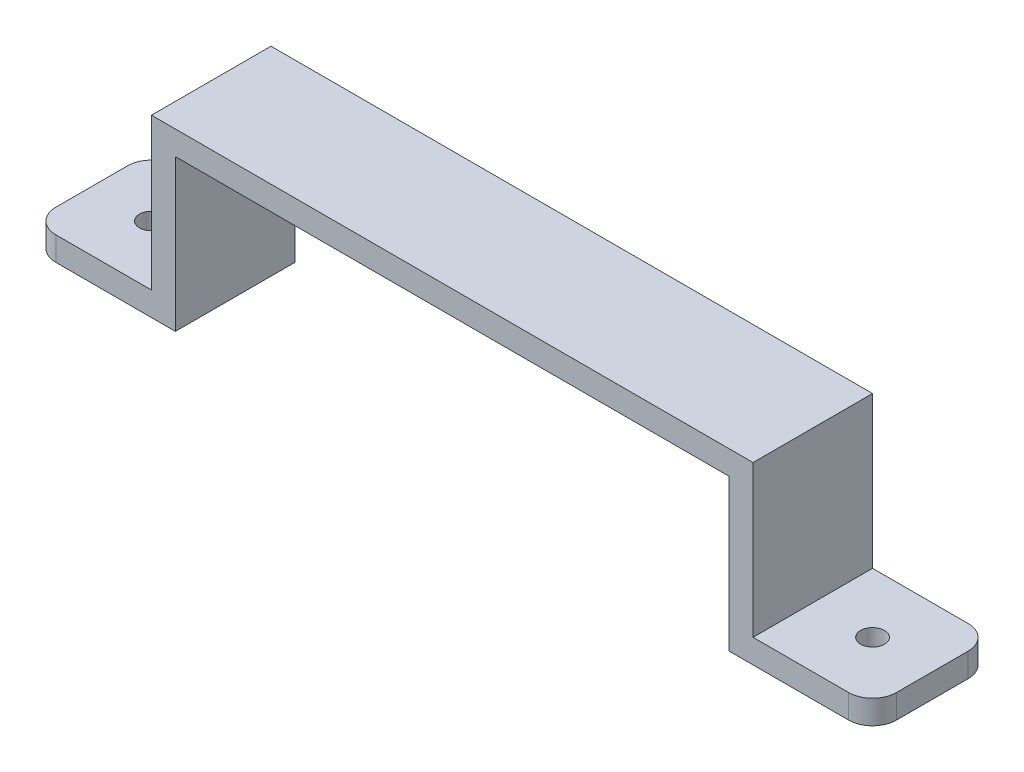
ISO-10303-21;
HEADER;
FILE_DESCRIPTION(('STEP AP214'),'2;1');
FILE_NAME('part.step','',(''),(''),'','','');
FILE_SCHEMA(('AUTOMOTIVE_DESIGN { 1 0 10303 214 1 1 1 1 }'));
ENDSEC;
DATA;
#1=APPLICATION_CONTEXT('core data for automotive mechanical design processes');
#2=APPLICATION_PROTOCOL_DEFINITION('international standard','automotive_design',2000,#1);
#3=PRODUCT_CONTEXT('',#1,'mechanical');
#4=PRODUCT('Part','Part','',(#3));
#5=PRODUCT_RELATED_PRODUCT_CATEGORY('part','',(#4));
#6=PRODUCT_DEFINITION_FORMATION('','',#4);
#7=PRODUCT_DEFINITION_CONTEXT('part definition',#1,'design');
#8=PRODUCT_DEFINITION('design','',#6,#7);
#9=PRODUCT_DEFINITION_SHAPE('','',#8);
#10=(LENGTH_UNIT() NAMED_UNIT(*) SI_UNIT(.MILLI.,.METRE.));
#11=(NAMED_UNIT(*) PLANE_ANGLE_UNIT() SI_UNIT($,.RADIAN.));
#12=(NAMED_UNIT(*) SI_UNIT($,.STERADIAN.) SOLID_ANGLE_UNIT());
#13=UNCERTAINTY_MEASURE_WITH_UNIT(LENGTH_MEASURE(1.E-05),#10,'distance_accuracy_value','');
#14=(GEOMETRIC_REPRESENTATION_CONTEXT(3) GLOBAL_UNCERTAINTY_ASSIGNED_CONTEXT((#13)) GLOBAL_UNIT_ASSIGNED_CONTEXT((#10,
#11,#12)) REPRESENTATION_CONTEXT('',''));
#15=CARTESIAN_POINT('',(0.,0.,0.));
#16=DIRECTION('',(0.,0.,1.));
#17=DIRECTION('',(1.,0.,0.));
#18=AXIS2_PLACEMENT_3D('',#15,#16,#17);
#19=CARTESIAN_POINT('',(-37.75,-19.,15.));
#20=DIRECTION('',(1.,0.,0.));
#21=DIRECTION('',(0.,0.,-1.));
#22=AXIS2_PLACEMENT_3D('',#19,#20,#21);
#23=PLANE('',#22);
#24=DIRECTION('',(0.,-1.,0.));
#25=VECTOR('',#24,1.);
#26=CARTESIAN_POINT('',(-37.75,-19.,0.));
#27=LINE('',#26,#25);
#28=CARTESIAN_POINT('',(-37.75,0.,0.));
#29=VERTEX_POINT('',#28);
#30=CARTESIAN_POINT('',(-37.75,-19.,0.));
#31=VERTEX_POINT('',#30);
#32=EDGE_CURVE('E184',#29,#31,#27,.T.);
#33=ORIENTED_EDGE('',*,*,#32,.T.);
#34=DIRECTION('',(0.,0.,-1.));
#35=VECTOR('',#34,1.);
#36=CARTESIAN_POINT('',(-37.75,-19.,15.));
#37=LINE('',#36,#35);
#38=CARTESIAN_POINT('',(-37.75,-19.,15.));
#39=VERTEX_POINT('',#38);
#40=EDGE_CURVE('E162',#39,#31,#37,.T.);
#41=ORIENTED_EDGE('',*,*,#40,.F.);
#42=DIRECTION('',(0.,-1.,0.));
#43=VECTOR('',#42,1.);
#44=CARTESIAN_POINT('',(-37.75,-19.,15.));
#45=LINE('',#44,#43);
#46=CARTESIAN_POINT('',(-37.75,0.,15.));
#47=VERTEX_POINT('',#46);
#48=EDGE_CURVE('E171',#47,#39,#45,.T.);
#49=ORIENTED_EDGE('',*,*,#48,.F.);
#50=DIRECTION('',(0.,0.,-1.));
#51=VECTOR('',#50,1.);
#52=CARTESIAN_POINT('',(-37.75,0.,15.));
#53=LINE('',#52,#51);
#54=EDGE_CURVE('E317',#47,#29,#53,.T.);
#55=ORIENTED_EDGE('',*,*,#54,.T.);
#56=EDGE_LOOP('',(#33,#41,#49,#55));
#57=FACE_BOUND('',#56,.T.);
#58=ADVANCED_FACE('F42',(#57),#23,.F.);
#59=CARTESIAN_POINT('',(-52.75,-19.,15.));
#60=DIRECTION('',(0.,-1.,0.));
#61=DIRECTION('',(0.,0.,-1.));
#62=AXIS2_PLACEMENT_3D('',#59,#60,#61);
#63=PLANE('',#62);
#64=CARTESIAN_POINT('',(-45.25,-19.,7.5));
#65=DIRECTION('',(0.,1.,0.));
#66=DIRECTION('',(0.,0.,1.));
#67=AXIS2_PLACEMENT_3D('',#64,#65,#66);
#68=CIRCLE('',#67,1.5);
#69=CARTESIAN_POINT('',(-45.25,-19.,9.00000000000001));
#70=VERTEX_POINT('',#69);
#71=EDGE_CURVE('E427',#70,#70,#68,.T.);
#72=ORIENTED_EDGE('',*,*,#71,.F.);
#73=EDGE_LOOP('',(#72));
#74=FACE_BOUND('',#73,.T.);
#75=DIRECTION('',(0.,0.,-1.));
#76=VECTOR('',#75,1.);
#77=CARTESIAN_POINT('',(-52.75,-19.,15.));
#78=LINE('',#77,#76);
#79=CARTESIAN_POINT('',(-52.75,-19.,12.));
#80=VERTEX_POINT('',#79);
#81=CARTESIAN_POINT('',(-52.75,-19.,3.));
#82=VERTEX_POINT('',#81);
#83=EDGE_CURVE('E187',#80,#82,#78,.T.);
#84=ORIENTED_EDGE('',*,*,#83,.F.);
#85=CARTESIAN_POINT('',(-49.75,-19.,12.));
#86=DIRECTION('',(0.,-1.,0.));
#87=DIRECTION('',(0.,0.,-1.));
#88=AXIS2_PLACEMENT_3D('',#85,#86,#87);
#89=CIRCLE('',#88,3.);
#90=CARTESIAN_POINT('',(-49.75,-19.,15.));
#91=VERTEX_POINT('',#90);
#92=EDGE_CURVE('E165',#80,#91,#89,.F.);
#93=ORIENTED_EDGE('',*,*,#92,.T.);
#94=DIRECTION('',(-1.,0.,0.));
#95=VECTOR('',#94,1.);
#96=CARTESIAN_POINT('',(-52.75,-19.,15.));
#97=LINE('',#96,#95);
#98=EDGE_CURVE('E156',#39,#91,#97,.T.);
#99=ORIENTED_EDGE('',*,*,#98,.F.);
#100=ORIENTED_EDGE('',*,*,#40,.T.);
#101=DIRECTION('',(-1.,0.,0.));
#102=VECTOR('',#101,1.);
#103=CARTESIAN_POINT('',(-52.75,-19.,0.));
#104=LINE('',#103,#102);
#105=CARTESIAN_POINT('',(-49.75,-19.,0.));
#106=VERTEX_POINT('',#105);
#107=EDGE_CURVE('E320',#31,#106,#104,.T.);
#108=ORIENTED_EDGE('',*,*,#107,.T.);
#109=CARTESIAN_POINT('',(-49.75,-19.,3.));
#110=DIRECTION('',(0.,-1.,0.));
#111=DIRECTION('',(0.,0.,-1.));
#112=AXIS2_PLACEMENT_3D('',#109,#110,#111);
#113=CIRCLE('',#112,3.);
#114=EDGE_CURVE('E219',#106,#82,#113,.F.);
#115=ORIENTED_EDGE('',*,*,#114,.T.);
#116=EDGE_LOOP('',(#84,#93,#99,#100,#108,#115));
#117=FACE_BOUND('',#116,.T.);
#118=ADVANCED_FACE('F159',(#74,#117),#63,.F.);
#119=CARTESIAN_POINT('',(-52.75,-22.,15.));
#120=DIRECTION('',(1.,0.,0.));
#121=DIRECTION('',(0.,0.,-1.));
#122=AXIS2_PLACEMENT_3D('',#119,#120,#121);
#123=PLANE('',#122);
#124=DIRECTION('',(0.,0.,-1.));
#125=VECTOR('',#124,1.);
#126=CARTESIAN_POINT('',(-52.75,-22.,15.));
#127=LINE('',#126,#125);
#128=CARTESIAN_POINT('',(-52.75,-22.,12.));
#129=VERTEX_POINT('',#128);
#130=CARTESIAN_POINT('',(-52.75,-22.,3.));
#131=VERTEX_POINT('',#130);
#132=EDGE_CURVE('E195',#129,#131,#127,.T.);
#133=ORIENTED_EDGE('',*,*,#132,.F.);
#134=DIRECTION('',(0.,-1.,0.));
#135=VECTOR('',#134,1.);
#136=CARTESIAN_POINT('',(-52.75,-22.,12.));
#137=LINE('',#136,#135);
#138=EDGE_CURVE('E216',#129,#80,#137,.F.);
#139=ORIENTED_EDGE('',*,*,#138,.T.);
#140=ORIENTED_EDGE('',*,*,#83,.T.);
#141=DIRECTION('',(0.,-1.,0.));
#142=VECTOR('',#141,1.);
#143=CARTESIAN_POINT('',(-52.75,-22.,3.));
#144=LINE('',#143,#142);
#145=EDGE_CURVE('E212',#82,#131,#144,.T.);
#146=ORIENTED_EDGE('',*,*,#145,.T.);
#147=EDGE_LOOP('',(#133,#139,#140,#146));
#148=FACE_BOUND('',#147,.T.);
#149=ADVANCED_FACE('F287',(#148),#123,.F.);
#150=CARTESIAN_POINT('',(-34.75,-22.,15.));
#151=DIRECTION('',(0.,1.,0.));
#152=DIRECTION('',(-1.,0.,0.));
#153=AXIS2_PLACEMENT_3D('',#150,#151,#152);
#154=PLANE('',#153);
#155=CARTESIAN_POINT('',(-45.25,-22.,7.5));
#156=DIRECTION('',(0.,1.,0.));
#157=DIRECTION('',(-1.,0.,0.));
#158=AXIS2_PLACEMENT_3D('',#155,#156,#157);
#159=CIRCLE('',#158,1.5);
#160=CARTESIAN_POINT('',(-46.75,-22.,7.5));
#161=VERTEX_POINT('',#160);
#162=EDGE_CURVE('E199',#161,#161,#159,.T.);
#163=ORIENTED_EDGE('',*,*,#162,.T.);
#164=EDGE_LOOP('',(#163));
#165=FACE_BOUND('',#164,.T.);
#166=DIRECTION('',(1.,0.,0.));
#167=VECTOR('',#166,1.);
#168=CARTESIAN_POINT('',(-34.75,-22.,15.));
#169=LINE('',#168,#167);
#170=CARTESIAN_POINT('',(-49.75,-22.,15.));
#171=VERTEX_POINT('',#170);
#172=CARTESIAN_POINT('',(-34.75,-22.,15.));
#173=VERTEX_POINT('',#172);
#174=EDGE_CURVE('E170',#171,#173,#169,.T.);
#175=ORIENTED_EDGE('',*,*,#174,.F.);
#176=CARTESIAN_POINT('',(-49.75,-22.,12.));
#177=DIRECTION('',(0.,1.,0.));
#178=DIRECTION('',(-1.,0.,0.));
#179=AXIS2_PLACEMENT_3D('',#176,#177,#178);
#180=CIRCLE('',#179,3.);
#181=EDGE_CURVE('E209',#171,#129,#180,.F.);
#182=ORIENTED_EDGE('',*,*,#181,.T.);
#183=ORIENTED_EDGE('',*,*,#132,.T.);
#184=CARTESIAN_POINT('',(-49.75,-22.,3.));
#185=DIRECTION('',(0.,1.,0.));
#186=DIRECTION('',(-1.,0.,0.));
#187=AXIS2_PLACEMENT_3D('',#184,#185,#186);
#188=CIRCLE('',#187,3.);
#189=CARTESIAN_POINT('',(-49.75,-22.,0.));
#190=VERTEX_POINT('',#189);
#191=EDGE_CURVE('E206',#131,#190,#188,.F.);
#192=ORIENTED_EDGE('',*,*,#191,.T.);
#193=DIRECTION('',(1.,0.,0.));
#194=VECTOR('',#193,1.);
#195=CARTESIAN_POINT('',(-34.75,-22.,0.));
#196=LINE('',#195,#194);
#197=CARTESIAN_POINT('',(-34.75,-22.,0.));
#198=VERTEX_POINT('',#197);
#199=EDGE_CURVE('E323',#190,#198,#196,.T.);
#200=ORIENTED_EDGE('',*,*,#199,.T.);
#201=DIRECTION('',(0.,0.,-1.));
#202=VECTOR('',#201,1.);
#203=CARTESIAN_POINT('',(-34.75,-22.,15.));
#204=LINE('',#203,#202);
#205=EDGE_CURVE('E275',#173,#198,#204,.T.);
#206=ORIENTED_EDGE('',*,*,#205,.F.);
#207=EDGE_LOOP('',(#175,#182,#183,#192,#200,#206));
#208=FACE_BOUND('',#207,.T.);
#209=ADVANCED_FACE('F283',(#165,#208),#154,.F.);
#210=CARTESIAN_POINT('',(-34.75,-3.00000000000001,15.));
#211=DIRECTION('',(-1.,0.,0.));
#212=DIRECTION('',(0.,0.,1.));
#213=AXIS2_PLACEMENT_3D('',#210,#211,#212);
#214=PLANE('',#213);
#215=DIRECTION('',(0.,1.,0.));
#216=VECTOR('',#215,1.);
#217=CARTESIAN_POINT('',(-34.75,-3.00000000000001,0.));
#218=LINE('',#217,#216);
#219=CARTESIAN_POINT('',(-34.75,-3.00000000000001,0.));
#220=VERTEX_POINT('',#219);
#221=EDGE_CURVE('E326',#198,#220,#218,.T.);
#222=ORIENTED_EDGE('',*,*,#221,.T.);
#223=DIRECTION('',(0.,0.,-1.));
#224=VECTOR('',#223,1.);
#225=CARTESIAN_POINT('',(-34.75,-3.00000000000001,15.));
#226=LINE('',#225,#224);
#227=CARTESIAN_POINT('',(-34.75,-3.00000000000001,15.));
#228=VERTEX_POINT('',#227);
#229=EDGE_CURVE('E271',#228,#220,#226,.T.);
#230=ORIENTED_EDGE('',*,*,#229,.F.);
#231=DIRECTION('',(0.,1.,0.));
#232=VECTOR('',#231,1.);
#233=CARTESIAN_POINT('',(-34.75,-3.00000000000001,15.));
#234=LINE('',#233,#232);
#235=EDGE_CURVE('E294',#173,#228,#234,.T.);
#236=ORIENTED_EDGE('',*,*,#235,.F.);
#237=ORIENTED_EDGE('',*,*,#205,.T.);
#238=EDGE_LOOP('',(#222,#230,#236,#237));
#239=FACE_BOUND('',#238,.T.);
#240=ADVANCED_FACE('F385',(#239),#214,.F.);
#241=CARTESIAN_POINT('',(34.75,-3.,15.));
#242=DIRECTION('',(0.,1.,0.));
#243=DIRECTION('',(-1.,0.,0.));
#244=AXIS2_PLACEMENT_3D('',#241,#242,#243);
#245=PLANE('',#244);
#246=DIRECTION('',(1.,0.,0.));
#247=VECTOR('',#246,1.);
#248=CARTESIAN_POINT('',(34.75,-3.,0.));
#249=LINE('',#248,#247);
#250=CARTESIAN_POINT('',(34.75,-3.,0.));
#251=VERTEX_POINT('',#250);
#252=EDGE_CURVE('E329',#220,#251,#249,.T.);
#253=ORIENTED_EDGE('',*,*,#252,.T.);
#254=DIRECTION('',(0.,0.,-1.));
#255=VECTOR('',#254,1.);
#256=CARTESIAN_POINT('',(34.75,-3.,15.));
#257=LINE('',#256,#255);
#258=CARTESIAN_POINT('',(34.75,-3.,15.));
#259=VERTEX_POINT('',#258);
#260=EDGE_CURVE('E267',#259,#251,#257,.T.);
#261=ORIENTED_EDGE('',*,*,#260,.F.);
#262=DIRECTION('',(1.,0.,0.));
#263=VECTOR('',#262,1.);
#264=CARTESIAN_POINT('',(34.75,-3.,15.));
#265=LINE('',#264,#263);
#266=EDGE_CURVE('E297',#228,#259,#265,.T.);
#267=ORIENTED_EDGE('',*,*,#266,.F.);
#268=ORIENTED_EDGE('',*,*,#229,.T.);
#269=EDGE_LOOP('',(#253,#261,#267,#268));
#270=FACE_BOUND('',#269,.T.);
#271=ADVANCED_FACE('F389',(#270),#245,.F.);
#272=CARTESIAN_POINT('',(34.75,-22.,15.));
#273=DIRECTION('',(1.,0.,0.));
#274=DIRECTION('',(0.,0.,-1.));
#275=AXIS2_PLACEMENT_3D('',#272,#273,#274);
#276=PLANE('',#275);
#277=DIRECTION('',(0.,-1.,0.));
#278=VECTOR('',#277,1.);
#279=CARTESIAN_POINT('',(34.75,-22.,0.));
#280=LINE('',#279,#278);
#281=CARTESIAN_POINT('',(34.75,-22.,0.));
#282=VERTEX_POINT('',#281);
#283=EDGE_CURVE('E332',#251,#282,#280,.T.);
#284=ORIENTED_EDGE('',*,*,#283,.T.);
#285=DIRECTION('',(0.,0.,-1.));
#286=VECTOR('',#285,1.);
#287=CARTESIAN_POINT('',(34.75,-22.,15.));
#288=LINE('',#287,#286);
#289=CARTESIAN_POINT('',(34.75,-22.,15.));
#290=VERTEX_POINT('',#289);
#291=EDGE_CURVE('E257',#290,#282,#288,.T.);
#292=ORIENTED_EDGE('',*,*,#291,.F.);
#293=DIRECTION('',(0.,-1.,0.));
#294=VECTOR('',#293,1.);
#295=CARTESIAN_POINT('',(34.75,-22.,15.));
#296=LINE('',#295,#294);
#297=EDGE_CURVE('E302',#259,#290,#296,.T.);
#298=ORIENTED_EDGE('',*,*,#297,.F.);
#299=ORIENTED_EDGE('',*,*,#260,.T.);
#300=EDGE_LOOP('',(#284,#292,#298,#299));
#301=FACE_BOUND('',#300,.T.);
#302=ADVANCED_FACE('F393',(#301),#276,.F.);
#303=CARTESIAN_POINT('',(52.75,-22.,15.));
#304=DIRECTION('',(0.,1.,0.));
#305=DIRECTION('',(-1.,0.,0.));
#306=AXIS2_PLACEMENT_3D('',#303,#304,#305);
#307=PLANE('',#306);
#308=CARTESIAN_POINT('',(45.25,-22.,7.5));
#309=DIRECTION('',(0.,1.,0.));
#310=DIRECTION('',(-1.,0.,0.));
#311=AXIS2_PLACEMENT_3D('',#308,#309,#310);
#312=CIRCLE('',#311,1.5);
#313=CARTESIAN_POINT('',(43.75,-22.,7.5));
#314=VERTEX_POINT('',#313);
#315=EDGE_CURVE('E202',#314,#314,#312,.T.);
#316=ORIENTED_EDGE('',*,*,#315,.T.);
#317=EDGE_LOOP('',(#316));
#318=FACE_BOUND('',#317,.T.);
#319=DIRECTION('',(0.,0.,-1.));
#320=VECTOR('',#319,1.);
#321=CARTESIAN_POINT('',(52.75,-22.,15.));
#322=LINE('',#321,#320);
#323=CARTESIAN_POINT('',(52.75,-22.,12.));
#324=VERTEX_POINT('',#323);
#325=CARTESIAN_POINT('',(52.75,-22.,3.));
#326=VERTEX_POINT('',#325);
#327=EDGE_CURVE('E246',#324,#326,#322,.T.);
#328=ORIENTED_EDGE('',*,*,#327,.F.);
#329=CARTESIAN_POINT('',(49.75,-22.,12.));
#330=DIRECTION('',(0.,1.,0.));
#331=DIRECTION('',(-1.,0.,0.));
#332=AXIS2_PLACEMENT_3D('',#329,#330,#331);
#333=CIRCLE('',#332,3.);
#334=CARTESIAN_POINT('',(49.75,-22.,15.));
#335=VERTEX_POINT('',#334);
#336=EDGE_CURVE('E11',#324,#335,#333,.F.);
#337=ORIENTED_EDGE('',*,*,#336,.T.);
#338=DIRECTION('',(1.,0.,0.));
#339=VECTOR('',#338,1.);
#340=CARTESIAN_POINT('',(52.75,-22.,15.));
#341=LINE('',#340,#339);
#342=EDGE_CURVE('E305',#290,#335,#341,.T.);
#343=ORIENTED_EDGE('',*,*,#342,.F.);
#344=ORIENTED_EDGE('',*,*,#291,.T.);
#345=DIRECTION('',(1.,0.,0.));
#346=VECTOR('',#345,1.);
#347=CARTESIAN_POINT('',(52.75,-22.,0.));
#348=LINE('',#347,#346);
#349=CARTESIAN_POINT('',(49.75,-22.,0.));
#350=VERTEX_POINT('',#349);
#351=EDGE_CURVE('E335',#282,#350,#348,.T.);
#352=ORIENTED_EDGE('',*,*,#351,.T.);
#353=CARTESIAN_POINT('',(49.75,-22.,3.));
#354=DIRECTION('',(0.,1.,0.));
#355=DIRECTION('',(-1.,0.,0.));
#356=AXIS2_PLACEMENT_3D('',#353,#354,#355);
#357=CIRCLE('',#356,3.);
#358=EDGE_CURVE('E51',#350,#326,#357,.F.);
#359=ORIENTED_EDGE('',*,*,#358,.T.);
#360=EDGE_LOOP('',(#328,#337,#343,#344,#352,#359));
#361=FACE_BOUND('',#360,.T.);
#362=ADVANCED_FACE('F397',(#318,#361),#307,.F.);
#363=CARTESIAN_POINT('',(52.75,-19.,15.));
#364=DIRECTION('',(-1.,0.,0.));
#365=DIRECTION('',(0.,0.,1.));
#366=AXIS2_PLACEMENT_3D('',#363,#364,#365);
#367=PLANE('',#366);
#368=DIRECTION('',(0.,0.,-1.));
#369=VECTOR('',#368,1.);
#370=CARTESIAN_POINT('',(52.75,-19.,15.));
#371=LINE('',#370,#369);
#372=CARTESIAN_POINT('',(52.75,-19.,12.));
#373=VERTEX_POINT('',#372);
#374=CARTESIAN_POINT('',(52.75,-19.,3.));
#375=VERTEX_POINT('',#374);
#376=EDGE_CURVE('E245',#373,#375,#371,.T.);
#377=ORIENTED_EDGE('',*,*,#376,.F.);
#378=DIRECTION('',(0.,1.,0.));
#379=VECTOR('',#378,1.);
#380=CARTESIAN_POINT('',(52.75,-19.,12.));
#381=LINE('',#380,#379);
#382=EDGE_CURVE('E64',#373,#324,#381,.F.);
#383=ORIENTED_EDGE('',*,*,#382,.T.);
#384=ORIENTED_EDGE('',*,*,#327,.T.);
#385=DIRECTION('',(0.,1.,0.));
#386=VECTOR('',#385,1.);
#387=CARTESIAN_POINT('',(52.75,-19.,3.));
#388=LINE('',#387,#386);
#389=EDGE_CURVE('E236',#326,#375,#388,.T.);
#390=ORIENTED_EDGE('',*,*,#389,.T.);
#391=EDGE_LOOP('',(#377,#383,#384,#390));
#392=FACE_BOUND('',#391,.T.);
#393=ADVANCED_FACE('F244',(#392),#367,.F.);
#394=CARTESIAN_POINT('',(37.75,-19.,15.));
#395=DIRECTION('',(0.,-1.,0.));
#396=DIRECTION('',(1.,0.,0.));
#397=AXIS2_PLACEMENT_3D('',#394,#395,#396);
#398=PLANE('',#397);
#399=CARTESIAN_POINT('',(45.25,-19.,7.5));
#400=DIRECTION('',(0.,1.,0.));
#401=DIRECTION('',(0.,0.,1.));
#402=AXIS2_PLACEMENT_3D('',#399,#400,#401);
#403=CIRCLE('',#402,1.5);
#404=CARTESIAN_POINT('',(45.25,-19.,9.00000000000001));
#405=VERTEX_POINT('',#404);
#406=EDGE_CURVE('E430',#405,#405,#403,.T.);
#407=ORIENTED_EDGE('',*,*,#406,.F.);
#408=EDGE_LOOP('',(#407));
#409=FACE_BOUND('',#408,.T.);
#410=DIRECTION('',(-1.,0.,0.));
#411=VECTOR('',#410,1.);
#412=CARTESIAN_POINT('',(37.75,-19.,15.));
#413=LINE('',#412,#411);
#414=CARTESIAN_POINT('',(49.75,-19.,15.));
#415=VERTEX_POINT('',#414);
#416=CARTESIAN_POINT('',(37.75,-19.,15.));
#417=VERTEX_POINT('',#416);
#418=EDGE_CURVE('E309',#415,#417,#413,.T.);
#419=ORIENTED_EDGE('',*,*,#418,.F.);
#420=CARTESIAN_POINT('',(49.75,-19.,12.));
#421=DIRECTION('',(0.,-1.,0.));
#422=DIRECTION('',(1.,0.,0.));
#423=AXIS2_PLACEMENT_3D('',#420,#421,#422);
#424=CIRCLE('',#423,3.);
#425=EDGE_CURVE('E233',#415,#373,#424,.F.);
#426=ORIENTED_EDGE('',*,*,#425,.T.);
#427=ORIENTED_EDGE('',*,*,#376,.T.);
#428=CARTESIAN_POINT('',(49.75,-19.,3.));
#429=DIRECTION('',(0.,-1.,0.));
#430=DIRECTION('',(1.,0.,0.));
#431=AXIS2_PLACEMENT_3D('',#428,#429,#430);
#432=CIRCLE('',#431,3.);
#433=CARTESIAN_POINT('',(49.75,-19.,0.));
#434=VERTEX_POINT('',#433);
#435=EDGE_CURVE('E230',#375,#434,#432,.F.);
#436=ORIENTED_EDGE('',*,*,#435,.T.);
#437=DIRECTION('',(-1.,0.,0.));
#438=VECTOR('',#437,1.);
#439=CARTESIAN_POINT('',(37.75,-19.,0.));
#440=LINE('',#439,#438);
#441=CARTESIAN_POINT('',(37.75,-19.,0.));
#442=VERTEX_POINT('',#441);
#443=EDGE_CURVE('E338',#434,#442,#440,.T.);
#444=ORIENTED_EDGE('',*,*,#443,.T.);
#445=DIRECTION('',(0.,0.,-1.));
#446=VECTOR('',#445,1.);
#447=CARTESIAN_POINT('',(37.75,-19.,15.));
#448=LINE('',#447,#446);
#449=EDGE_CURVE('E253',#417,#442,#448,.T.);
#450=ORIENTED_EDGE('',*,*,#449,.F.);
#451=EDGE_LOOP('',(#419,#426,#427,#436,#444,#450));
#452=FACE_BOUND('',#451,.T.);
#453=ADVANCED_FACE('F250',(#409,#452),#398,.F.);
#454=CARTESIAN_POINT('',(37.75,0.,15.));
#455=DIRECTION('',(-1.,0.,0.));
#456=DIRECTION('',(0.,0.,1.));
#457=AXIS2_PLACEMENT_3D('',#454,#455,#456);
#458=PLANE('',#457);
#459=DIRECTION('',(0.,1.,0.));
#460=VECTOR('',#459,1.);
#461=CARTESIAN_POINT('',(37.75,0.,0.));
#462=LINE('',#461,#460);
#463=CARTESIAN_POINT('',(37.75,0.,0.));
#464=VERTEX_POINT('',#463);
#465=EDGE_CURVE('E341',#442,#464,#462,.T.);
#466=ORIENTED_EDGE('',*,*,#465,.T.);
#467=DIRECTION('',(0.,0.,-1.));
#468=VECTOR('',#467,1.);
#469=CARTESIAN_POINT('',(37.75,0.,15.));
#470=LINE('',#469,#468);
#471=CARTESIAN_POINT('',(37.75,0.,15.));
#472=VERTEX_POINT('',#471);
#473=EDGE_CURVE('E260',#472,#464,#470,.T.);
#474=ORIENTED_EDGE('',*,*,#473,.F.);
#475=DIRECTION('',(0.,1.,0.));
#476=VECTOR('',#475,1.);
#477=CARTESIAN_POINT('',(37.75,0.,15.));
#478=LINE('',#477,#476);
#479=EDGE_CURVE('E312',#417,#472,#478,.T.);
#480=ORIENTED_EDGE('',*,*,#479,.F.);
#481=ORIENTED_EDGE('',*,*,#449,.T.);
#482=EDGE_LOOP('',(#466,#474,#480,#481));
#483=FACE_BOUND('',#482,.T.);
#484=ADVANCED_FACE('F406',(#483),#458,.F.);
#485=CARTESIAN_POINT('',(-37.75,0.,15.));
#486=DIRECTION('',(0.,-1.,0.));
#487=DIRECTION('',(1.,0.,0.));
#488=AXIS2_PLACEMENT_3D('',#485,#486,#487);
#489=PLANE('',#488);
#490=DIRECTION('',(-1.,0.,0.));
#491=VECTOR('',#490,1.);
#492=CARTESIAN_POINT('',(-37.75,0.,0.));
#493=LINE('',#492,#491);
#494=EDGE_CURVE('E181',#464,#29,#493,.T.);
#495=ORIENTED_EDGE('',*,*,#494,.T.);
#496=ORIENTED_EDGE('',*,*,#54,.F.);
#497=DIRECTION('',(-1.,0.,0.));
#498=VECTOR('',#497,1.);
#499=CARTESIAN_POINT('',(-37.75,0.,15.));
#500=LINE('',#499,#498);
#501=EDGE_CURVE('E176',#472,#47,#500,.T.);
#502=ORIENTED_EDGE('',*,*,#501,.F.);
#503=ORIENTED_EDGE('',*,*,#473,.T.);
#504=EDGE_LOOP('',(#495,#496,#502,#503));
#505=FACE_BOUND('',#504,.T.);
#506=ADVANCED_FACE('F352',(#505),#489,.F.);
#507=CARTESIAN_POINT('',(0.,0.,15.));
#508=DIRECTION('',(0.,0.,-1.));
#509=DIRECTION('',(-1.,0.,0.));
#510=AXIS2_PLACEMENT_3D('',#507,#508,#509);
#511=PLANE('',#510);
#512=ORIENTED_EDGE('',*,*,#98,.T.);
#513=DIRECTION('',(0.,-1.,0.));
#514=VECTOR('',#513,1.);
#515=CARTESIAN_POINT('',(-49.75,0.,15.));
#516=LINE('',#515,#514);
#517=EDGE_CURVE('E192',#91,#171,#516,.T.);
#518=ORIENTED_EDGE('',*,*,#517,.T.);
#519=ORIENTED_EDGE('',*,*,#174,.T.);
#520=ORIENTED_EDGE('',*,*,#235,.T.);
#521=ORIENTED_EDGE('',*,*,#266,.T.);
#522=ORIENTED_EDGE('',*,*,#297,.T.);
#523=ORIENTED_EDGE('',*,*,#342,.T.);
#524=DIRECTION('',(0.,1.,0.));
#525=VECTOR('',#524,1.);
#526=CARTESIAN_POINT('',(49.75,0.,15.));
#527=LINE('',#526,#525);
#528=EDGE_CURVE('E186',#335,#415,#527,.T.);
#529=ORIENTED_EDGE('',*,*,#528,.T.);
#530=ORIENTED_EDGE('',*,*,#418,.T.);
#531=ORIENTED_EDGE('',*,*,#479,.T.);
#532=ORIENTED_EDGE('',*,*,#501,.T.);
#533=ORIENTED_EDGE('',*,*,#48,.T.);
#534=EDGE_LOOP('',(#512,#518,#519,#520,#521,#522,#523,#529,#530,#531,#532,#533));
#535=FACE_BOUND('',#534,.T.);
#536=ADVANCED_FACE('F174',(#535),#511,.F.);
#537=CARTESIAN_POINT('',(0.,0.,0.));
#538=DIRECTION('',(0.,0.,-1.));
#539=DIRECTION('',(-1.,0.,0.));
#540=AXIS2_PLACEMENT_3D('',#537,#538,#539);
#541=PLANE('',#540);
#542=ORIENTED_EDGE('',*,*,#199,.F.);
#543=DIRECTION('',(0.,-1.,0.));
#544=VECTOR('',#543,1.);
#545=CARTESIAN_POINT('',(-49.75,-19.,0.));
#546=LINE('',#545,#544);
#547=EDGE_CURVE('E227',#190,#106,#546,.F.);
#548=ORIENTED_EDGE('',*,*,#547,.T.);
#549=ORIENTED_EDGE('',*,*,#107,.F.);
#550=ORIENTED_EDGE('',*,*,#32,.F.);
#551=ORIENTED_EDGE('',*,*,#494,.F.);
#552=ORIENTED_EDGE('',*,*,#465,.F.);
#553=ORIENTED_EDGE('',*,*,#443,.F.);
#554=DIRECTION('',(0.,1.,0.));
#555=VECTOR('',#554,1.);
#556=CARTESIAN_POINT('',(49.75,-22.,0.));
#557=LINE('',#556,#555);
#558=EDGE_CURVE('E224',#434,#350,#557,.F.);
#559=ORIENTED_EDGE('',*,*,#558,.T.);
#560=ORIENTED_EDGE('',*,*,#351,.F.);
#561=ORIENTED_EDGE('',*,*,#283,.F.);
#562=ORIENTED_EDGE('',*,*,#252,.F.);
#563=ORIENTED_EDGE('',*,*,#221,.F.);
#564=EDGE_LOOP('',(#542,#548,#549,#550,#551,#552,#553,#559,#560,#561,#562,#563));
#565=FACE_BOUND('',#564,.T.);
#566=ADVANCED_FACE('F357',(#565),#541,.T.);
#567=CARTESIAN_POINT('',(45.25,-39.,7.5));
#568=DIRECTION('',(0.,1.,0.));
#569=DIRECTION('',(0.,0.,1.));
#570=AXIS2_PLACEMENT_3D('',#567,#568,#569);
#571=CYLINDRICAL_SURFACE('',#570,1.5);
#572=ORIENTED_EDGE('',*,*,#406,.T.);
#573=EDGE_LOOP('',(#572));
#574=FACE_BOUND('',#573,.T.);
#575=ORIENTED_EDGE('',*,*,#315,.F.);
#576=EDGE_LOOP('',(#575));
#577=FACE_BOUND('',#576,.T.);
#578=ADVANCED_FACE('F414',(#574,#577),#571,.F.);
#579=CARTESIAN_POINT('',(-45.25,-39.,7.5));
#580=DIRECTION('',(0.,1.,0.));
#581=DIRECTION('',(0.,0.,1.));
#582=AXIS2_PLACEMENT_3D('',#579,#580,#581);
#583=CYLINDRICAL_SURFACE('',#582,1.5);
#584=ORIENTED_EDGE('',*,*,#71,.T.);
#585=EDGE_LOOP('',(#584));
#586=FACE_BOUND('',#585,.T.);
#587=ORIENTED_EDGE('',*,*,#162,.F.);
#588=EDGE_LOOP('',(#587));
#589=FACE_BOUND('',#588,.T.);
#590=ADVANCED_FACE('F370',(#586,#589),#583,.F.);
#591=CARTESIAN_POINT('',(-49.75,0.,12.));
#592=DIRECTION('',(0.,-1.,0.));
#593=DIRECTION('',(0.,0.,-1.));
#594=AXIS2_PLACEMENT_3D('',#591,#592,#593);
#595=CYLINDRICAL_SURFACE('',#594,3.);
#596=ORIENTED_EDGE('',*,*,#92,.F.);
#597=ORIENTED_EDGE('',*,*,#138,.F.);
#598=ORIENTED_EDGE('',*,*,#181,.F.);
#599=ORIENTED_EDGE('',*,*,#517,.F.);
#600=EDGE_LOOP('',(#596,#597,#598,#599));
#601=FACE_BOUND('',#600,.T.);
#602=ADVANCED_FACE('F290',(#601),#595,.T.);
#603=CARTESIAN_POINT('',(-49.75,-22.,3.));
#604=DIRECTION('',(0.,1.,0.));
#605=DIRECTION('',(0.,0.,1.));
#606=AXIS2_PLACEMENT_3D('',#603,#604,#605);
#607=CYLINDRICAL_SURFACE('',#606,3.);
#608=ORIENTED_EDGE('',*,*,#114,.F.);
#609=ORIENTED_EDGE('',*,*,#547,.F.);
#610=ORIENTED_EDGE('',*,*,#191,.F.);
#611=ORIENTED_EDGE('',*,*,#145,.F.);
#612=EDGE_LOOP('',(#608,#609,#610,#611));
#613=FACE_BOUND('',#612,.T.);
#614=ADVANCED_FACE('F361',(#613),#607,.T.);
#615=CARTESIAN_POINT('',(49.75,0.,12.));
#616=DIRECTION('',(0.,1.,0.));
#617=DIRECTION('',(0.,0.,1.));
#618=AXIS2_PLACEMENT_3D('',#615,#616,#617);
#619=CYLINDRICAL_SURFACE('',#618,3.);
#620=ORIENTED_EDGE('',*,*,#336,.F.);
#621=ORIENTED_EDGE('',*,*,#382,.F.);
#622=ORIENTED_EDGE('',*,*,#425,.F.);
#623=ORIENTED_EDGE('',*,*,#528,.F.);
#624=EDGE_LOOP('',(#620,#621,#622,#623));
#625=FACE_BOUND('',#624,.T.);
#626=ADVANCED_FACE('F363',(#625),#619,.T.);
#627=CARTESIAN_POINT('',(49.75,-19.,3.));
#628=DIRECTION('',(0.,-1.,0.));
#629=DIRECTION('',(0.,0.,-1.));
#630=AXIS2_PLACEMENT_3D('',#627,#628,#629);
#631=CYLINDRICAL_SURFACE('',#630,3.);
#632=ORIENTED_EDGE('',*,*,#358,.F.);
#633=ORIENTED_EDGE('',*,*,#558,.F.);
#634=ORIENTED_EDGE('',*,*,#435,.F.);
#635=ORIENTED_EDGE('',*,*,#389,.F.);
#636=EDGE_LOOP('',(#632,#633,#634,#635));
#637=FACE_BOUND('',#636,.T.);
#638=ADVANCED_FACE('F44',(#637),#631,.T.);
#639=CLOSED_SHELL('',(#58,#118,#149,#209,#240,#271,#302,#362,#393,#453,#484,#506,#536,#566,#578,
#590,#602,#614,#626,#638));
#640=MANIFOLD_SOLID_BREP('B2',#639);
#641=ADVANCED_BREP_SHAPE_REPRESENTATION('',(#18,#640),#14);
#642=SHAPE_DEFINITION_REPRESENTATION(#9,#641);
ENDSEC;
END-ISO-10303-21;
